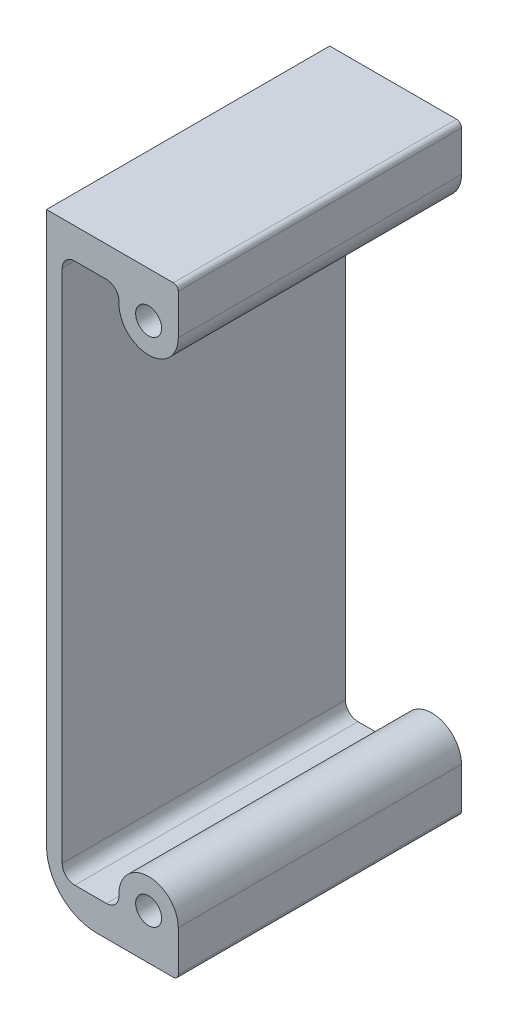
ISO-10303-21;
HEADER;
FILE_DESCRIPTION(('STEP AP214'),'2;1');
FILE_NAME('part.step','',(''),(''),'','','');
FILE_SCHEMA(('AUTOMOTIVE_DESIGN { 1 0 10303 214 1 1 1 1 }'));
ENDSEC;
DATA;
#1=APPLICATION_CONTEXT('core data for automotive mechanical design processes');
#2=APPLICATION_PROTOCOL_DEFINITION('international standard','automotive_design',2000,#1);
#3=PRODUCT_CONTEXT('',#1,'mechanical');
#4=PRODUCT('Part','Part','',(#3));
#5=PRODUCT_RELATED_PRODUCT_CATEGORY('part','',(#4));
#6=PRODUCT_DEFINITION_FORMATION('','',#4);
#7=PRODUCT_DEFINITION_CONTEXT('part definition',#1,'design');
#8=PRODUCT_DEFINITION('design','',#6,#7);
#9=PRODUCT_DEFINITION_SHAPE('','',#8);
#10=(LENGTH_UNIT() NAMED_UNIT(*) SI_UNIT(.MILLI.,.METRE.));
#11=(NAMED_UNIT(*) PLANE_ANGLE_UNIT() SI_UNIT($,.RADIAN.));
#12=(NAMED_UNIT(*) SI_UNIT($,.STERADIAN.) SOLID_ANGLE_UNIT());
#13=UNCERTAINTY_MEASURE_WITH_UNIT(LENGTH_MEASURE(1.E-05),#10,'distance_accuracy_value','');
#14=(GEOMETRIC_REPRESENTATION_CONTEXT(3) GLOBAL_UNCERTAINTY_ASSIGNED_CONTEXT((#13)) GLOBAL_UNIT_ASSIGNED_CONTEXT((#10,
#11,#12)) REPRESENTATION_CONTEXT('',''));
#15=CARTESIAN_POINT('',(0.,0.,0.));
#16=DIRECTION('',(0.,0.,1.));
#17=DIRECTION('',(1.,0.,0.));
#18=AXIS2_PLACEMENT_3D('',#15,#16,#17);
#19=CARTESIAN_POINT('',(32.7436170041979,-45.3716174977111,57.3024));
#20=DIRECTION('',(0.,0.,1.));
#21=DIRECTION('',(1.,0.,0.));
#22=AXIS2_PLACEMENT_3D('',#19,#20,#21);
#23=PLANE('',#22);
#24=CARTESIAN_POINT('',(32.7436170041979,-45.3716174977111,57.3024));
#25=DIRECTION('',(0.,0.,1.));
#26=DIRECTION('',(1.,0.,0.));
#27=AXIS2_PLACEMENT_3D('',#24,#25,#26);
#28=CIRCLE('',#27,2.62508999997144);
#29=CARTESIAN_POINT('',(35.3687070041693,-45.3716174977111,57.3024));
#30=VERTEX_POINT('',#29);
#31=EDGE_CURVE('E313',#30,#30,#28,.T.);
#32=ORIENTED_EDGE('',*,*,#31,.F.);
#33=EDGE_LOOP('',(#32));
#34=FACE_BOUND('',#33,.T.);
#35=DIRECTION('',(0.,-1.,0.));
#36=VECTOR('',#35,1.);
#37=CARTESIAN_POINT('',(12.0836170041979,-54.5460974977111,57.3024));
#38=LINE('',#37,#36);
#39=CARTESIAN_POINT('',(12.0836170041979,67.1608625022889,57.3024));
#40=VERTEX_POINT('',#39);
#41=CARTESIAN_POINT('',(12.0836170041979,-44.3860974977111,57.3024));
#42=VERTEX_POINT('',#41);
#43=EDGE_CURVE('E316',#40,#42,#38,.T.);
#44=ORIENTED_EDGE('',*,*,#43,.T.);
#45=CARTESIAN_POINT('',(22.2436170041979,-44.3860974977111,57.3024));
#46=DIRECTION('',(0.,0.,1.));
#47=DIRECTION('',(1.,0.,0.));
#48=AXIS2_PLACEMENT_3D('',#45,#46,#47);
#49=CIRCLE('',#48,10.16);
#50=CARTESIAN_POINT('',(22.2436170041979,-54.5460974977111,57.3024));
#51=VERTEX_POINT('',#50);
#52=EDGE_CURVE('E11',#42,#51,#49,.T.);
#53=ORIENTED_EDGE('',*,*,#52,.T.);
#54=DIRECTION('',(1.,0.,0.));
#55=VECTOR('',#54,1.);
#56=CARTESIAN_POINT('',(32.7436170041979,-54.5460974977111,57.3024));
#57=LINE('',#56,#55);
#58=CARTESIAN_POINT('',(37.7430970042033,-54.5460974977111,57.3024));
#59=VERTEX_POINT('',#58);
#60=EDGE_CURVE('E261',#51,#59,#57,.T.);
#61=ORIENTED_EDGE('',*,*,#60,.T.);
#62=CARTESIAN_POINT('',(37.7430970042033,-53.5460974977111,57.3024));
#63=DIRECTION('',(0.,0.,1.));
#64=DIRECTION('',(1.,0.,0.));
#65=AXIS2_PLACEMENT_3D('',#62,#63,#64);
#66=CIRCLE('',#65,1.);
#67=CARTESIAN_POINT('',(38.7430970042033,-53.5460974977111,57.3024));
#68=VERTEX_POINT('',#67);
#69=EDGE_CURVE('E243',#59,#68,#66,.T.);
#70=ORIENTED_EDGE('',*,*,#69,.T.);
#71=DIRECTION('',(0.,1.,0.));
#72=VECTOR('',#71,1.);
#73=CARTESIAN_POINT('',(38.7430970042033,-45.3716174977111,57.3024));
#74=LINE('',#73,#72);
#75=CARTESIAN_POINT('',(38.7430970042033,-45.3716174977111,57.3024));
#76=VERTEX_POINT('',#75);
#77=EDGE_CURVE('E182',#68,#76,#74,.T.);
#78=ORIENTED_EDGE('',*,*,#77,.T.);
#79=CARTESIAN_POINT('',(32.7436170041979,-45.3716174977111,57.3024));
#80=DIRECTION('',(0.,0.,1.));
#81=DIRECTION('',(1.,0.,0.));
#82=AXIS2_PLACEMENT_3D('',#79,#80,#81);
#83=CIRCLE('',#82,5.99948000000544);
#84=CARTESIAN_POINT('',(26.7441370041924,-45.3716174977111,57.3024));
#85=VERTEX_POINT('',#84);
#86=EDGE_CURVE('E177',#76,#85,#83,.T.);
#87=ORIENTED_EDGE('',*,*,#86,.T.);
#88=DIRECTION('',(0.,-1.,0.));
#89=VECTOR('',#88,1.);
#90=CARTESIAN_POINT('',(26.7441370041924,-45.3716174977111,57.3024));
#91=LINE('',#90,#89);
#92=CARTESIAN_POINT('',(26.7441370041924,-45.8313574977111,57.3024));
#93=VERTEX_POINT('',#92);
#94=EDGE_CURVE('E165',#85,#93,#91,.T.);
#95=ORIENTED_EDGE('',*,*,#94,.T.);
#96=CARTESIAN_POINT('',(24.2041370041924,-45.8313574977111,57.3024));
#97=DIRECTION('',(0.,0.,1.));
#98=DIRECTION('',(1.,0.,0.));
#99=AXIS2_PLACEMENT_3D('',#96,#97,#98);
#100=CIRCLE('',#99,2.54);
#101=CARTESIAN_POINT('',(24.2041370041924,-48.3713574977111,57.3024));
#102=VERTEX_POINT('',#101);
#103=EDGE_CURVE('E227',#93,#102,#100,.F.);
#104=ORIENTED_EDGE('',*,*,#103,.T.);
#105=DIRECTION('',(-1.,0.,0.));
#106=VECTOR('',#105,1.);
#107=CARTESIAN_POINT('',(26.7441370041924,-48.3713574977111,57.3024));
#108=LINE('',#107,#106);
#109=CARTESIAN_POINT('',(17.7986170041979,-48.3713574977111,57.3024));
#110=VERTEX_POINT('',#109);
#111=EDGE_CURVE('E176',#102,#110,#108,.T.);
#112=ORIENTED_EDGE('',*,*,#111,.T.);
#113=CARTESIAN_POINT('',(17.7986170041979,-45.8313574977111,57.3024));
#114=DIRECTION('',(0.,0.,1.));
#115=DIRECTION('',(1.,0.,0.));
#116=AXIS2_PLACEMENT_3D('',#113,#114,#115);
#117=CIRCLE('',#116,2.54);
#118=CARTESIAN_POINT('',(15.2586170041979,-45.8313574977111,57.3024));
#119=VERTEX_POINT('',#118);
#120=EDGE_CURVE('E231',#110,#119,#117,.F.);
#121=ORIENTED_EDGE('',*,*,#120,.T.);
#122=DIRECTION('',(0.,1.,0.));
#123=VECTOR('',#122,1.);
#124=CARTESIAN_POINT('',(15.2586170041979,60.9861225022889,57.3024));
#125=LINE('',#124,#123);
#126=CARTESIAN_POINT('',(15.2586170041979,58.4461225022889,57.3024));
#127=VERTEX_POINT('',#126);
#128=EDGE_CURVE('E328',#119,#127,#125,.T.);
#129=ORIENTED_EDGE('',*,*,#128,.T.);
#130=CARTESIAN_POINT('',(17.7986170041979,58.4461225022889,57.3024));
#131=DIRECTION('',(0.,0.,1.));
#132=DIRECTION('',(1.,0.,0.));
#133=AXIS2_PLACEMENT_3D('',#130,#131,#132);
#134=CIRCLE('',#133,2.54);
#135=CARTESIAN_POINT('',(17.7986170041979,60.9861225022889,57.3024));
#136=VERTEX_POINT('',#135);
#137=EDGE_CURVE('E223',#127,#136,#134,.F.);
#138=ORIENTED_EDGE('',*,*,#137,.T.);
#139=DIRECTION('',(1.,0.,0.));
#140=VECTOR('',#139,1.);
#141=CARTESIAN_POINT('',(26.7441370041924,60.9861225022889,57.3024));
#142=LINE('',#141,#140);
#143=CARTESIAN_POINT('',(24.2041370041924,60.9861225022889,57.3024));
#144=VERTEX_POINT('',#143);
#145=EDGE_CURVE('E325',#136,#144,#142,.T.);
#146=ORIENTED_EDGE('',*,*,#145,.T.);
#147=CARTESIAN_POINT('',(24.2041370041924,58.4461225022889,57.3024));
#148=DIRECTION('',(0.,0.,1.));
#149=DIRECTION('',(1.,0.,0.));
#150=AXIS2_PLACEMENT_3D('',#147,#148,#149);
#151=CIRCLE('',#150,2.54);
#152=CARTESIAN_POINT('',(26.7441370041924,58.4461225022889,57.3024));
#153=VERTEX_POINT('',#152);
#154=EDGE_CURVE('E219',#144,#153,#151,.F.);
#155=ORIENTED_EDGE('',*,*,#154,.T.);
#156=DIRECTION('',(0.,-1.,0.));
#157=VECTOR('',#156,1.);
#158=CARTESIAN_POINT('',(26.7441370041924,57.9863825022889,57.3024));
#159=LINE('',#158,#157);
#160=CARTESIAN_POINT('',(26.7441370041924,57.9863825022889,57.3024));
#161=VERTEX_POINT('',#160);
#162=EDGE_CURVE('E323',#153,#161,#159,.T.);
#163=ORIENTED_EDGE('',*,*,#162,.T.);
#164=CARTESIAN_POINT('',(32.7436170041978,57.9863825022889,57.3024));
#165=DIRECTION('',(0.,0.,1.));
#166=DIRECTION('',(-1.,0.,0.));
#167=AXIS2_PLACEMENT_3D('',#164,#165,#166);
#168=CIRCLE('',#167,5.99948000000544);
#169=CARTESIAN_POINT('',(38.7430970042033,57.9863825022889,57.3024));
#170=VERTEX_POINT('',#169);
#171=EDGE_CURVE('E321',#161,#170,#168,.T.);
#172=ORIENTED_EDGE('',*,*,#171,.T.);
#173=DIRECTION('',(0.,1.,0.));
#174=VECTOR('',#173,1.);
#175=CARTESIAN_POINT('',(38.7430970042033,57.9863825022889,57.3024));
#176=LINE('',#175,#174);
#177=CARTESIAN_POINT('',(38.7430970042033,66.1608625022889,57.3024));
#178=VERTEX_POINT('',#177);
#179=EDGE_CURVE('E289',#170,#178,#176,.T.);
#180=ORIENTED_EDGE('',*,*,#179,.T.);
#181=CARTESIAN_POINT('',(37.7430970042033,66.1608625022889,57.3024));
#182=DIRECTION('',(0.,0.,1.));
#183=DIRECTION('',(1.,0.,0.));
#184=AXIS2_PLACEMENT_3D('',#181,#182,#183);
#185=CIRCLE('',#184,1.);
#186=CARTESIAN_POINT('',(37.7430970042033,67.1608625022889,57.3024));
#187=VERTEX_POINT('',#186);
#188=EDGE_CURVE('E245',#178,#187,#185,.T.);
#189=ORIENTED_EDGE('',*,*,#188,.T.);
#190=DIRECTION('',(-1.,0.,0.));
#191=VECTOR('',#190,1.);
#192=CARTESIAN_POINT('',(38.7430970042033,67.1608625022889,57.3024));
#193=LINE('',#192,#191);
#194=EDGE_CURVE('E318',#187,#40,#193,.T.);
#195=ORIENTED_EDGE('',*,*,#194,.T.);
#196=EDGE_LOOP('',(#44,#53,#61,#70,#78,#87,#95,#104,#112,#121,#129,#138,#146,#155,#163,#172,
#180,#189,#195));
#197=FACE_BOUND('',#196,.T.);
#198=CARTESIAN_POINT('',(32.7436170041978,57.9863825022889,57.3024));
#199=DIRECTION('',(0.,0.,1.));
#200=DIRECTION('',(1.,0.,0.));
#201=AXIS2_PLACEMENT_3D('',#198,#199,#200);
#202=CIRCLE('',#201,2.62890000000001);
#203=CARTESIAN_POINT('',(35.3725170041978,57.9863825022889,57.3024));
#204=VERTEX_POINT('',#203);
#205=EDGE_CURVE('E336',#204,#204,#202,.T.);
#206=ORIENTED_EDGE('',*,*,#205,.F.);
#207=EDGE_LOOP('',(#206));
#208=FACE_BOUND('',#207,.T.);
#209=ADVANCED_FACE('F34',(#34,#197,#208),#23,.T.);
#210=CARTESIAN_POINT('',(32.7436170041979,-45.3716174977111,0.));
#211=DIRECTION('',(0.,0.,1.));
#212=DIRECTION('',(1.,0.,0.));
#213=AXIS2_PLACEMENT_3D('',#210,#211,#212);
#214=PLANE('',#213);
#215=DIRECTION('',(1.,0.,0.));
#216=VECTOR('',#215,1.);
#217=CARTESIAN_POINT('',(38.7430970042033,-54.5460974977111,0.));
#218=LINE('',#217,#216);
#219=CARTESIAN_POINT('',(22.2436170041979,-54.5460974977111,0.));
#220=VERTEX_POINT('',#219);
#221=CARTESIAN_POINT('',(37.7430970042033,-54.5460974977111,0.));
#222=VERTEX_POINT('',#221);
#223=EDGE_CURVE('E260',#220,#222,#218,.T.);
#224=ORIENTED_EDGE('',*,*,#223,.F.);
#225=CARTESIAN_POINT('',(22.2436170041979,-44.3860974977111,0.));
#226=DIRECTION('',(0.,0.,1.));
#227=DIRECTION('',(1.,0.,0.));
#228=AXIS2_PLACEMENT_3D('',#225,#226,#227);
#229=CIRCLE('',#228,10.16);
#230=CARTESIAN_POINT('',(12.0836170041979,-44.3860974977111,0.));
#231=VERTEX_POINT('',#230);
#232=EDGE_CURVE('E56',#220,#231,#229,.F.);
#233=ORIENTED_EDGE('',*,*,#232,.T.);
#234=DIRECTION('',(0.,-1.,0.));
#235=VECTOR('',#234,1.);
#236=CARTESIAN_POINT('',(12.0836170041979,-54.5460974977111,0.));
#237=LINE('',#236,#235);
#238=CARTESIAN_POINT('',(12.0836170041979,67.1608625022889,0.));
#239=VERTEX_POINT('',#238);
#240=EDGE_CURVE('E268',#239,#231,#237,.T.);
#241=ORIENTED_EDGE('',*,*,#240,.F.);
#242=DIRECTION('',(-1.,0.,0.));
#243=VECTOR('',#242,1.);
#244=CARTESIAN_POINT('',(32.7436170041978,67.1608625022889,0.));
#245=LINE('',#244,#243);
#246=CARTESIAN_POINT('',(37.7430970042033,67.1608625022889,0.));
#247=VERTEX_POINT('',#246);
#248=EDGE_CURVE('E271',#247,#239,#245,.T.);
#249=ORIENTED_EDGE('',*,*,#248,.F.);
#250=CARTESIAN_POINT('',(37.7430970042033,66.1608625022889,0.));
#251=DIRECTION('',(0.,0.,1.));
#252=DIRECTION('',(1.,0.,0.));
#253=AXIS2_PLACEMENT_3D('',#250,#251,#252);
#254=CIRCLE('',#253,1.);
#255=CARTESIAN_POINT('',(38.7430970042033,66.1608625022889,0.));
#256=VERTEX_POINT('',#255);
#257=EDGE_CURVE('E239',#247,#256,#254,.F.);
#258=ORIENTED_EDGE('',*,*,#257,.T.);
#259=DIRECTION('',(0.,1.,0.));
#260=VECTOR('',#259,1.);
#261=CARTESIAN_POINT('',(38.7430970042033,57.9863825022889,0.));
#262=LINE('',#261,#260);
#263=CARTESIAN_POINT('',(38.7430970042033,57.9863825022889,0.));
#264=VERTEX_POINT('',#263);
#265=EDGE_CURVE('E286',#264,#256,#262,.T.);
#266=ORIENTED_EDGE('',*,*,#265,.F.);
#267=CARTESIAN_POINT('',(32.7436170041978,57.9863825022889,0.));
#268=DIRECTION('',(0.,0.,1.));
#269=DIRECTION('',(-1.,0.,0.));
#270=AXIS2_PLACEMENT_3D('',#267,#268,#269);
#271=CIRCLE('',#270,5.99948000000544);
#272=CARTESIAN_POINT('',(26.7441370041924,57.9863825022889,0.));
#273=VERTEX_POINT('',#272);
#274=EDGE_CURVE('E294',#273,#264,#271,.T.);
#275=ORIENTED_EDGE('',*,*,#274,.F.);
#276=DIRECTION('',(0.,-1.,0.));
#277=VECTOR('',#276,1.);
#278=CARTESIAN_POINT('',(26.7441370041924,57.9863825022889,0.));
#279=LINE('',#278,#277);
#280=CARTESIAN_POINT('',(26.7441370041924,58.4461225022889,0.));
#281=VERTEX_POINT('',#280);
#282=EDGE_CURVE('E297',#281,#273,#279,.T.);
#283=ORIENTED_EDGE('',*,*,#282,.F.);
#284=CARTESIAN_POINT('',(24.2041370041924,58.4461225022889,0.));
#285=DIRECTION('',(0.,0.,1.));
#286=DIRECTION('',(1.,0.,0.));
#287=AXIS2_PLACEMENT_3D('',#284,#285,#286);
#288=CIRCLE('',#287,2.54);
#289=CARTESIAN_POINT('',(24.2041370041924,60.9861225022889,0.));
#290=VERTEX_POINT('',#289);
#291=EDGE_CURVE('E217',#281,#290,#288,.T.);
#292=ORIENTED_EDGE('',*,*,#291,.T.);
#293=DIRECTION('',(1.,0.,0.));
#294=VECTOR('',#293,1.);
#295=CARTESIAN_POINT('',(26.7441370041924,60.9861225022889,0.));
#296=LINE('',#295,#294);
#297=CARTESIAN_POINT('',(17.7986170041979,60.9861225022889,0.));
#298=VERTEX_POINT('',#297);
#299=EDGE_CURVE('E301',#298,#290,#296,.T.);
#300=ORIENTED_EDGE('',*,*,#299,.F.);
#301=CARTESIAN_POINT('',(17.7986170041979,58.4461225022889,0.));
#302=DIRECTION('',(0.,0.,1.));
#303=DIRECTION('',(1.,0.,0.));
#304=AXIS2_PLACEMENT_3D('',#301,#302,#303);
#305=CIRCLE('',#304,2.54);
#306=CARTESIAN_POINT('',(15.2586170041979,58.4461225022889,0.));
#307=VERTEX_POINT('',#306);
#308=EDGE_CURVE('E221',#298,#307,#305,.T.);
#309=ORIENTED_EDGE('',*,*,#308,.T.);
#310=DIRECTION('',(0.,1.,0.));
#311=VECTOR('',#310,1.);
#312=CARTESIAN_POINT('',(15.2586170041979,60.9861225022889,0.));
#313=LINE('',#312,#311);
#314=CARTESIAN_POINT('',(15.2586170041979,-45.8313574977111,0.));
#315=VERTEX_POINT('',#314);
#316=EDGE_CURVE('E304',#315,#307,#313,.T.);
#317=ORIENTED_EDGE('',*,*,#316,.F.);
#318=CARTESIAN_POINT('',(17.7986170041979,-45.8313574977111,0.));
#319=DIRECTION('',(0.,0.,1.));
#320=DIRECTION('',(1.,0.,0.));
#321=AXIS2_PLACEMENT_3D('',#318,#319,#320);
#322=CIRCLE('',#321,2.54);
#323=CARTESIAN_POINT('',(17.7986170041979,-48.3713574977111,0.));
#324=VERTEX_POINT('',#323);
#325=EDGE_CURVE('E229',#315,#324,#322,.T.);
#326=ORIENTED_EDGE('',*,*,#325,.T.);
#327=DIRECTION('',(-1.,0.,0.));
#328=VECTOR('',#327,1.);
#329=CARTESIAN_POINT('',(26.7441370041924,-48.3713574977111,0.));
#330=LINE('',#329,#328);
#331=CARTESIAN_POINT('',(24.2041370041924,-48.3713574977111,0.));
#332=VERTEX_POINT('',#331);
#333=EDGE_CURVE('E307',#332,#324,#330,.T.);
#334=ORIENTED_EDGE('',*,*,#333,.F.);
#335=CARTESIAN_POINT('',(24.2041370041924,-45.8313574977111,0.));
#336=DIRECTION('',(0.,0.,1.));
#337=DIRECTION('',(1.,0.,0.));
#338=AXIS2_PLACEMENT_3D('',#335,#336,#337);
#339=CIRCLE('',#338,2.54);
#340=CARTESIAN_POINT('',(26.7441370041924,-45.8313574977111,0.));
#341=VERTEX_POINT('',#340);
#342=EDGE_CURVE('E225',#332,#341,#339,.T.);
#343=ORIENTED_EDGE('',*,*,#342,.T.);
#344=DIRECTION('',(0.,-1.,0.));
#345=VECTOR('',#344,1.);
#346=CARTESIAN_POINT('',(26.7441370041924,-45.3716174977111,0.));
#347=LINE('',#346,#345);
#348=CARTESIAN_POINT('',(26.7441370041924,-45.3716174977111,0.));
#349=VERTEX_POINT('',#348);
#350=EDGE_CURVE('E310',#349,#341,#347,.T.);
#351=ORIENTED_EDGE('',*,*,#350,.F.);
#352=CARTESIAN_POINT('',(32.7436170041979,-45.3716174977111,0.));
#353=DIRECTION('',(0.,0.,1.));
#354=DIRECTION('',(1.,0.,0.));
#355=AXIS2_PLACEMENT_3D('',#352,#353,#354);
#356=CIRCLE('',#355,5.99948000000544);
#357=CARTESIAN_POINT('',(38.7430970042033,-45.3716174977111,0.));
#358=VERTEX_POINT('',#357);
#359=EDGE_CURVE('E190',#358,#349,#356,.T.);
#360=ORIENTED_EDGE('',*,*,#359,.F.);
#361=DIRECTION('',(0.,1.,0.));
#362=VECTOR('',#361,1.);
#363=CARTESIAN_POINT('',(38.7430970042033,-45.3716174977111,0.));
#364=LINE('',#363,#362);
#365=CARTESIAN_POINT('',(38.7430970042033,-53.5460974977111,0.));
#366=VERTEX_POINT('',#365);
#367=EDGE_CURVE('E186',#366,#358,#364,.T.);
#368=ORIENTED_EDGE('',*,*,#367,.F.);
#369=CARTESIAN_POINT('',(37.7430970042033,-53.5460974977111,0.));
#370=DIRECTION('',(0.,0.,1.));
#371=DIRECTION('',(1.,0.,0.));
#372=AXIS2_PLACEMENT_3D('',#369,#370,#371);
#373=CIRCLE('',#372,1.);
#374=EDGE_CURVE('E236',#366,#222,#373,.F.);
#375=ORIENTED_EDGE('',*,*,#374,.T.);
#376=EDGE_LOOP('',(#224,#233,#241,#249,#258,#266,#275,#283,#292,#300,#309,#317,#326,#334,#343,
#351,#360,#368,#375));
#377=FACE_BOUND('',#376,.T.);
#378=CARTESIAN_POINT('',(32.7436170041979,-45.3716174977111,0.));
#379=DIRECTION('',(0.,0.,1.));
#380=DIRECTION('',(1.,0.,0.));
#381=AXIS2_PLACEMENT_3D('',#378,#379,#380);
#382=CIRCLE('',#381,2.62508999997144);
#383=CARTESIAN_POINT('',(35.3687070041693,-45.3716174977111,0.));
#384=VERTEX_POINT('',#383);
#385=EDGE_CURVE('E333',#384,#384,#382,.T.);
#386=ORIENTED_EDGE('',*,*,#385,.T.);
#387=EDGE_LOOP('',(#386));
#388=FACE_BOUND('',#387,.T.);
#389=CARTESIAN_POINT('',(32.7436170041978,57.9863825022889,0.));
#390=DIRECTION('',(0.,0.,1.));
#391=DIRECTION('',(1.,0.,0.));
#392=AXIS2_PLACEMENT_3D('',#389,#390,#391);
#393=CIRCLE('',#392,2.62890000000001);
#394=CARTESIAN_POINT('',(35.3725170041978,57.9863825022889,0.));
#395=VERTEX_POINT('',#394);
#396=EDGE_CURVE('E339',#395,#395,#393,.T.);
#397=ORIENTED_EDGE('',*,*,#396,.T.);
#398=EDGE_LOOP('',(#397));
#399=FACE_BOUND('',#398,.T.);
#400=ADVANCED_FACE('F264',(#377,#388,#399),#214,.F.);
#401=CARTESIAN_POINT('',(32.7436170041979,-45.3716174977111,57.3024));
#402=DIRECTION('',(0.,0.,-1.));
#403=DIRECTION('',(-1.,0.,0.));
#404=AXIS2_PLACEMENT_3D('',#401,#402,#403);
#405=CYLINDRICAL_SURFACE('',#404,5.99948000000544);
#406=ORIENTED_EDGE('',*,*,#359,.T.);
#407=DIRECTION('',(0.,0.,-1.));
#408=VECTOR('',#407,1.);
#409=CARTESIAN_POINT('',(26.7441370041924,-45.3716174977111,57.3024));
#410=LINE('',#409,#408);
#411=EDGE_CURVE('E170',#85,#349,#410,.T.);
#412=ORIENTED_EDGE('',*,*,#411,.F.);
#413=ORIENTED_EDGE('',*,*,#86,.F.);
#414=DIRECTION('',(0.,0.,-1.));
#415=VECTOR('',#414,1.);
#416=CARTESIAN_POINT('',(38.7430970042033,-45.3716174977111,57.3024));
#417=LINE('',#416,#415);
#418=EDGE_CURVE('E275',#76,#358,#417,.T.);
#419=ORIENTED_EDGE('',*,*,#418,.T.);
#420=EDGE_LOOP('',(#406,#412,#413,#419));
#421=FACE_BOUND('',#420,.T.);
#422=ADVANCED_FACE('F188',(#421),#405,.T.);
#423=CARTESIAN_POINT('',(26.7441370041924,-45.3716174977111,57.3024));
#424=DIRECTION('',(1.,0.,0.));
#425=DIRECTION('',(0.,0.,-1.));
#426=AXIS2_PLACEMENT_3D('',#423,#424,#425);
#427=PLANE('',#426);
#428=ORIENTED_EDGE('',*,*,#350,.T.);
#429=DIRECTION('',(0.,0.,-1.));
#430=VECTOR('',#429,1.);
#431=CARTESIAN_POINT('',(26.7441370041924,-45.8313574977111,57.3024));
#432=LINE('',#431,#430);
#433=EDGE_CURVE('E173',#341,#93,#432,.F.);
#434=ORIENTED_EDGE('',*,*,#433,.T.);
#435=ORIENTED_EDGE('',*,*,#94,.F.);
#436=ORIENTED_EDGE('',*,*,#411,.T.);
#437=EDGE_LOOP('',(#428,#434,#435,#436));
#438=FACE_BOUND('',#437,.T.);
#439=ADVANCED_FACE('F168',(#438),#427,.F.);
#440=CARTESIAN_POINT('',(26.7441370041924,-48.3713574977111,57.3024));
#441=DIRECTION('',(0.,-1.,0.));
#442=DIRECTION('',(1.,0.,0.));
#443=AXIS2_PLACEMENT_3D('',#440,#441,#442);
#444=PLANE('',#443);
#445=ORIENTED_EDGE('',*,*,#111,.F.);
#446=DIRECTION('',(0.,0.,-1.));
#447=VECTOR('',#446,1.);
#448=CARTESIAN_POINT('',(24.2041370041924,-48.3713574977111,0.));
#449=LINE('',#448,#447);
#450=EDGE_CURVE('E213',#102,#332,#449,.T.);
#451=ORIENTED_EDGE('',*,*,#450,.T.);
#452=ORIENTED_EDGE('',*,*,#333,.T.);
#453=DIRECTION('',(0.,0.,-1.));
#454=VECTOR('',#453,1.);
#455=CARTESIAN_POINT('',(17.7986170041979,-48.3713574977111,57.3024));
#456=LINE('',#455,#454);
#457=EDGE_CURVE('E211',#324,#110,#456,.F.);
#458=ORIENTED_EDGE('',*,*,#457,.T.);
#459=EDGE_LOOP('',(#445,#451,#452,#458));
#460=FACE_BOUND('',#459,.T.);
#461=ADVANCED_FACE('F388',(#460),#444,.F.);
#462=CARTESIAN_POINT('',(15.2586170041979,60.9861225022889,57.3024));
#463=DIRECTION('',(-1.,0.,0.));
#464=DIRECTION('',(0.,-1.,0.));
#465=AXIS2_PLACEMENT_3D('',#462,#463,#464);
#466=PLANE('',#465);
#467=ORIENTED_EDGE('',*,*,#316,.T.);
#468=DIRECTION('',(0.,0.,-1.));
#469=VECTOR('',#468,1.);
#470=CARTESIAN_POINT('',(15.2586170041979,58.4461225022889,57.3024));
#471=LINE('',#470,#469);
#472=EDGE_CURVE('E209',#307,#127,#471,.F.);
#473=ORIENTED_EDGE('',*,*,#472,.T.);
#474=ORIENTED_EDGE('',*,*,#128,.F.);
#475=DIRECTION('',(0.,0.,-1.));
#476=VECTOR('',#475,1.);
#477=CARTESIAN_POINT('',(15.2586170041979,-45.8313574977111,0.));
#478=LINE('',#477,#476);
#479=EDGE_CURVE('E206',#119,#315,#478,.T.);
#480=ORIENTED_EDGE('',*,*,#479,.T.);
#481=EDGE_LOOP('',(#467,#473,#474,#480));
#482=FACE_BOUND('',#481,.T.);
#483=ADVANCED_FACE('F384',(#482),#466,.F.);
#484=CARTESIAN_POINT('',(26.7441370041924,60.9861225022889,57.3024));
#485=DIRECTION('',(0.,1.,0.));
#486=DIRECTION('',(0.,0.,1.));
#487=AXIS2_PLACEMENT_3D('',#484,#485,#486);
#488=PLANE('',#487);
#489=ORIENTED_EDGE('',*,*,#299,.T.);
#490=DIRECTION('',(0.,0.,-1.));
#491=VECTOR('',#490,1.);
#492=CARTESIAN_POINT('',(24.2041370041924,60.9861225022889,57.3024));
#493=LINE('',#492,#491);
#494=EDGE_CURVE('E204',#290,#144,#493,.F.);
#495=ORIENTED_EDGE('',*,*,#494,.T.);
#496=ORIENTED_EDGE('',*,*,#145,.F.);
#497=DIRECTION('',(0.,0.,-1.));
#498=VECTOR('',#497,1.);
#499=CARTESIAN_POINT('',(17.7986170041979,60.9861225022889,0.));
#500=LINE('',#499,#498);
#501=EDGE_CURVE('E195',#136,#298,#500,.T.);
#502=ORIENTED_EDGE('',*,*,#501,.T.);
#503=EDGE_LOOP('',(#489,#495,#496,#502));
#504=FACE_BOUND('',#503,.T.);
#505=ADVANCED_FACE('F380',(#504),#488,.F.);
#506=CARTESIAN_POINT('',(26.7441370041924,57.9863825022889,57.3024));
#507=DIRECTION('',(1.,0.,0.));
#508=DIRECTION('',(0.,0.,-1.));
#509=AXIS2_PLACEMENT_3D('',#506,#507,#508);
#510=PLANE('',#509);
#511=ORIENTED_EDGE('',*,*,#162,.F.);
#512=DIRECTION('',(0.,0.,-1.));
#513=VECTOR('',#512,1.);
#514=CARTESIAN_POINT('',(26.7441370041924,58.4461225022889,0.));
#515=LINE('',#514,#513);
#516=EDGE_CURVE('E191',#153,#281,#515,.T.);
#517=ORIENTED_EDGE('',*,*,#516,.T.);
#518=ORIENTED_EDGE('',*,*,#282,.T.);
#519=DIRECTION('',(0.,0.,-1.));
#520=VECTOR('',#519,1.);
#521=CARTESIAN_POINT('',(26.7441370041924,57.9863825022889,57.3024));
#522=LINE('',#521,#520);
#523=EDGE_CURVE('E192',#161,#273,#522,.T.);
#524=ORIENTED_EDGE('',*,*,#523,.F.);
#525=EDGE_LOOP('',(#511,#517,#518,#524));
#526=FACE_BOUND('',#525,.T.);
#527=ADVANCED_FACE('F377',(#526),#510,.F.);
#528=CARTESIAN_POINT('',(32.7436170041978,57.9863825022889,57.3024));
#529=DIRECTION('',(0.,0.,-1.));
#530=DIRECTION('',(-1.,0.,0.));
#531=AXIS2_PLACEMENT_3D('',#528,#529,#530);
#532=CYLINDRICAL_SURFACE('',#531,5.99948000000544);
#533=ORIENTED_EDGE('',*,*,#274,.T.);
#534=DIRECTION('',(0.,0.,-1.));
#535=VECTOR('',#534,1.);
#536=CARTESIAN_POINT('',(38.7430970042033,57.9863825022889,57.3024));
#537=LINE('',#536,#535);
#538=EDGE_CURVE('E198',#170,#264,#537,.T.);
#539=ORIENTED_EDGE('',*,*,#538,.F.);
#540=ORIENTED_EDGE('',*,*,#171,.F.);
#541=ORIENTED_EDGE('',*,*,#523,.T.);
#542=EDGE_LOOP('',(#533,#539,#540,#541));
#543=FACE_BOUND('',#542,.T.);
#544=ADVANCED_FACE('F374',(#543),#532,.T.);
#545=CARTESIAN_POINT('',(38.7430970042033,57.9863825022889,57.3024));
#546=DIRECTION('',(-1.,0.,0.));
#547=DIRECTION('',(0.,0.,1.));
#548=AXIS2_PLACEMENT_3D('',#545,#546,#547);
#549=PLANE('',#548);
#550=ORIENTED_EDGE('',*,*,#265,.T.);
#551=DIRECTION('',(0.,0.,-1.));
#552=VECTOR('',#551,1.);
#553=CARTESIAN_POINT('',(38.7430970042033,66.1608625022889,57.3024));
#554=LINE('',#553,#552);
#555=EDGE_CURVE('E241',#256,#178,#554,.F.);
#556=ORIENTED_EDGE('',*,*,#555,.T.);
#557=ORIENTED_EDGE('',*,*,#179,.F.);
#558=ORIENTED_EDGE('',*,*,#538,.T.);
#559=EDGE_LOOP('',(#550,#556,#557,#558));
#560=FACE_BOUND('',#559,.T.);
#561=ADVANCED_FACE('F285',(#560),#549,.F.);
#562=CARTESIAN_POINT('',(32.7436170041978,67.1608625022889,57.3024));
#563=DIRECTION('',(0.,-1.,0.));
#564=DIRECTION('',(1.,0.,0.));
#565=AXIS2_PLACEMENT_3D('',#562,#563,#564);
#566=PLANE('',#565);
#567=ORIENTED_EDGE('',*,*,#194,.F.);
#568=DIRECTION('',(0.,0.,-1.));
#569=VECTOR('',#568,1.);
#570=CARTESIAN_POINT('',(37.7430970042033,67.1608625022889,57.3024));
#571=LINE('',#570,#569);
#572=EDGE_CURVE('E233',#187,#247,#571,.T.);
#573=ORIENTED_EDGE('',*,*,#572,.T.);
#574=ORIENTED_EDGE('',*,*,#248,.T.);
#575=DIRECTION('',(0.,0.,-1.));
#576=VECTOR('',#575,1.);
#577=CARTESIAN_POINT('',(12.0836170041979,67.1608625022889,57.3024));
#578=LINE('',#577,#576);
#579=EDGE_CURVE('E277',#40,#239,#578,.T.);
#580=ORIENTED_EDGE('',*,*,#579,.F.);
#581=EDGE_LOOP('',(#567,#573,#574,#580));
#582=FACE_BOUND('',#581,.T.);
#583=ADVANCED_FACE('F368',(#582),#566,.F.);
#584=CARTESIAN_POINT('',(12.0836170041979,-54.5460974977111,57.3024));
#585=DIRECTION('',(1.,0.,0.));
#586=DIRECTION('',(0.,1.,0.));
#587=AXIS2_PLACEMENT_3D('',#584,#585,#586);
#588=PLANE('',#587);
#589=ORIENTED_EDGE('',*,*,#240,.T.);
#590=DIRECTION('',(0.,0.,-1.));
#591=VECTOR('',#590,1.);
#592=CARTESIAN_POINT('',(12.0836170041979,-44.3860974977111,57.3024));
#593=LINE('',#592,#591);
#594=EDGE_CURVE('E42',#231,#42,#593,.F.);
#595=ORIENTED_EDGE('',*,*,#594,.T.);
#596=ORIENTED_EDGE('',*,*,#43,.F.);
#597=ORIENTED_EDGE('',*,*,#579,.T.);
#598=EDGE_LOOP('',(#589,#595,#596,#597));
#599=FACE_BOUND('',#598,.T.);
#600=ADVANCED_FACE('F365',(#599),#588,.F.);
#601=CARTESIAN_POINT('',(38.7430970042033,-54.5460974977111,57.3024));
#602=DIRECTION('',(0.,1.,0.));
#603=DIRECTION('',(0.,0.,1.));
#604=AXIS2_PLACEMENT_3D('',#601,#602,#603);
#605=PLANE('',#604);
#606=ORIENTED_EDGE('',*,*,#60,.F.);
#607=DIRECTION('',(0.,0.,-1.));
#608=VECTOR('',#607,1.);
#609=CARTESIAN_POINT('',(22.2436170041979,-54.5460974977111,57.3024));
#610=LINE('',#609,#608);
#611=EDGE_CURVE('E253',#51,#220,#610,.T.);
#612=ORIENTED_EDGE('',*,*,#611,.T.);
#613=ORIENTED_EDGE('',*,*,#223,.T.);
#614=DIRECTION('',(0.,0.,-1.));
#615=VECTOR('',#614,1.);
#616=CARTESIAN_POINT('',(37.7430970042033,-54.5460974977111,57.3024));
#617=LINE('',#616,#615);
#618=EDGE_CURVE('E250',#222,#59,#617,.F.);
#619=ORIENTED_EDGE('',*,*,#618,.T.);
#620=EDGE_LOOP('',(#606,#612,#613,#619));
#621=FACE_BOUND('',#620,.T.);
#622=ADVANCED_FACE('F259',(#621),#605,.F.);
#623=CARTESIAN_POINT('',(38.7430970042033,-45.3716174977111,57.3024));
#624=DIRECTION('',(-1.,0.,0.));
#625=DIRECTION('',(0.,0.,1.));
#626=AXIS2_PLACEMENT_3D('',#623,#624,#625);
#627=PLANE('',#626);
#628=ORIENTED_EDGE('',*,*,#77,.F.);
#629=DIRECTION('',(0.,0.,-1.));
#630=VECTOR('',#629,1.);
#631=CARTESIAN_POINT('',(38.7430970042033,-53.5460974977111,57.3024));
#632=LINE('',#631,#630);
#633=EDGE_CURVE('E247',#68,#366,#632,.T.);
#634=ORIENTED_EDGE('',*,*,#633,.T.);
#635=ORIENTED_EDGE('',*,*,#367,.T.);
#636=ORIENTED_EDGE('',*,*,#418,.F.);
#637=EDGE_LOOP('',(#628,#634,#635,#636));
#638=FACE_BOUND('',#637,.T.);
#639=ADVANCED_FACE('F359',(#638),#627,.F.);
#640=CARTESIAN_POINT('',(32.7436170041979,-45.3716174977111,57.3024));
#641=DIRECTION('',(0.,0.,-1.));
#642=DIRECTION('',(-1.,0.,0.));
#643=AXIS2_PLACEMENT_3D('',#640,#641,#642);
#644=CYLINDRICAL_SURFACE('',#643,2.62508999997144);
#645=ORIENTED_EDGE('',*,*,#31,.T.);
#646=EDGE_LOOP('',(#645));
#647=FACE_BOUND('',#646,.T.);
#648=ORIENTED_EDGE('',*,*,#385,.F.);
#649=EDGE_LOOP('',(#648));
#650=FACE_BOUND('',#649,.T.);
#651=ADVANCED_FACE('F356',(#647,#650),#644,.F.);
#652=CARTESIAN_POINT('',(32.7436170041978,57.9863825022889,57.3024));
#653=DIRECTION('',(0.,0.,-1.));
#654=DIRECTION('',(-1.,0.,0.));
#655=AXIS2_PLACEMENT_3D('',#652,#653,#654);
#656=CYLINDRICAL_SURFACE('',#655,2.62890000000001);
#657=ORIENTED_EDGE('',*,*,#205,.T.);
#658=EDGE_LOOP('',(#657));
#659=FACE_BOUND('',#658,.T.);
#660=ORIENTED_EDGE('',*,*,#396,.F.);
#661=EDGE_LOOP('',(#660));
#662=FACE_BOUND('',#661,.T.);
#663=ADVANCED_FACE('F345',(#659,#662),#656,.F.);
#664=CARTESIAN_POINT('',(24.2041370041924,58.4461225022889,57.3024));
#665=DIRECTION('',(0.,0.,1.));
#666=DIRECTION('',(1.,0.,0.));
#667=AXIS2_PLACEMENT_3D('',#664,#665,#666);
#668=CYLINDRICAL_SURFACE('',#667,2.54);
#669=ORIENTED_EDGE('',*,*,#154,.F.);
#670=ORIENTED_EDGE('',*,*,#494,.F.);
#671=ORIENTED_EDGE('',*,*,#291,.F.);
#672=ORIENTED_EDGE('',*,*,#516,.F.);
#673=EDGE_LOOP('',(#669,#670,#671,#672));
#674=FACE_BOUND('',#673,.T.);
#675=ADVANCED_FACE('F397',(#674),#668,.F.);
#676=CARTESIAN_POINT('',(17.7986170041979,58.4461225022889,57.3024));
#677=DIRECTION('',(0.,0.,1.));
#678=DIRECTION('',(1.,0.,0.));
#679=AXIS2_PLACEMENT_3D('',#676,#677,#678);
#680=CYLINDRICAL_SURFACE('',#679,2.54);
#681=ORIENTED_EDGE('',*,*,#137,.F.);
#682=ORIENTED_EDGE('',*,*,#472,.F.);
#683=ORIENTED_EDGE('',*,*,#308,.F.);
#684=ORIENTED_EDGE('',*,*,#501,.F.);
#685=EDGE_LOOP('',(#681,#682,#683,#684));
#686=FACE_BOUND('',#685,.T.);
#687=ADVANCED_FACE('F400',(#686),#680,.F.);
#688=CARTESIAN_POINT('',(24.2041370041924,-45.8313574977111,57.3024));
#689=DIRECTION('',(0.,0.,1.));
#690=DIRECTION('',(1.,0.,0.));
#691=AXIS2_PLACEMENT_3D('',#688,#689,#690);
#692=CYLINDRICAL_SURFACE('',#691,2.54);
#693=ORIENTED_EDGE('',*,*,#103,.F.);
#694=ORIENTED_EDGE('',*,*,#433,.F.);
#695=ORIENTED_EDGE('',*,*,#342,.F.);
#696=ORIENTED_EDGE('',*,*,#450,.F.);
#697=EDGE_LOOP('',(#693,#694,#695,#696));
#698=FACE_BOUND('',#697,.T.);
#699=ADVANCED_FACE('F404',(#698),#692,.F.);
#700=CARTESIAN_POINT('',(17.7986170041979,-45.8313574977111,57.3024));
#701=DIRECTION('',(0.,0.,1.));
#702=DIRECTION('',(1.,0.,0.));
#703=AXIS2_PLACEMENT_3D('',#700,#701,#702);
#704=CYLINDRICAL_SURFACE('',#703,2.54);
#705=ORIENTED_EDGE('',*,*,#120,.F.);
#706=ORIENTED_EDGE('',*,*,#457,.F.);
#707=ORIENTED_EDGE('',*,*,#325,.F.);
#708=ORIENTED_EDGE('',*,*,#479,.F.);
#709=EDGE_LOOP('',(#705,#706,#707,#708));
#710=FACE_BOUND('',#709,.T.);
#711=ADVANCED_FACE('F408',(#710),#704,.F.);
#712=CARTESIAN_POINT('',(37.7430970042033,66.1608625022889,57.3024));
#713=DIRECTION('',(0.,0.,-1.));
#714=DIRECTION('',(-1.,0.,0.));
#715=AXIS2_PLACEMENT_3D('',#712,#713,#714);
#716=CYLINDRICAL_SURFACE('',#715,1.);
#717=ORIENTED_EDGE('',*,*,#188,.F.);
#718=ORIENTED_EDGE('',*,*,#555,.F.);
#719=ORIENTED_EDGE('',*,*,#257,.F.);
#720=ORIENTED_EDGE('',*,*,#572,.F.);
#721=EDGE_LOOP('',(#717,#718,#719,#720));
#722=FACE_BOUND('',#721,.T.);
#723=ADVANCED_FACE('F412',(#722),#716,.T.);
#724=CARTESIAN_POINT('',(37.7430970042033,-53.5460974977111,57.3024));
#725=DIRECTION('',(0.,0.,-1.));
#726=DIRECTION('',(-1.,0.,0.));
#727=AXIS2_PLACEMENT_3D('',#724,#725,#726);
#728=CYLINDRICAL_SURFACE('',#727,1.);
#729=ORIENTED_EDGE('',*,*,#69,.F.);
#730=ORIENTED_EDGE('',*,*,#618,.F.);
#731=ORIENTED_EDGE('',*,*,#374,.F.);
#732=ORIENTED_EDGE('',*,*,#633,.F.);
#733=EDGE_LOOP('',(#729,#730,#731,#732));
#734=FACE_BOUND('',#733,.T.);
#735=ADVANCED_FACE('F415',(#734),#728,.T.);
#736=CARTESIAN_POINT('',(22.2436170041979,-44.3860974977111,57.3024));
#737=DIRECTION('',(0.,0.,-1.));
#738=DIRECTION('',(-1.,0.,0.));
#739=AXIS2_PLACEMENT_3D('',#736,#737,#738);
#740=CYLINDRICAL_SURFACE('',#739,10.16);
#741=ORIENTED_EDGE('',*,*,#52,.F.);
#742=ORIENTED_EDGE('',*,*,#594,.F.);
#743=ORIENTED_EDGE('',*,*,#232,.F.);
#744=ORIENTED_EDGE('',*,*,#611,.F.);
#745=EDGE_LOOP('',(#741,#742,#743,#744));
#746=FACE_BOUND('',#745,.T.);
#747=ADVANCED_FACE('F36',(#746),#740,.T.);
#748=CLOSED_SHELL('',(#209,#400,#422,#439,#461,#483,#505,#527,#544,#561,#583,#600,#622,#639,
#651,#663,#675,#687,#699,#711,#723,#735,#747));
#749=MANIFOLD_SOLID_BREP('B2',#748);
#750=ADVANCED_BREP_SHAPE_REPRESENTATION('',(#18,#749),#14);
#751=SHAPE_DEFINITION_REPRESENTATION(#9,#750);
ENDSEC;
END-ISO-10303-21;
